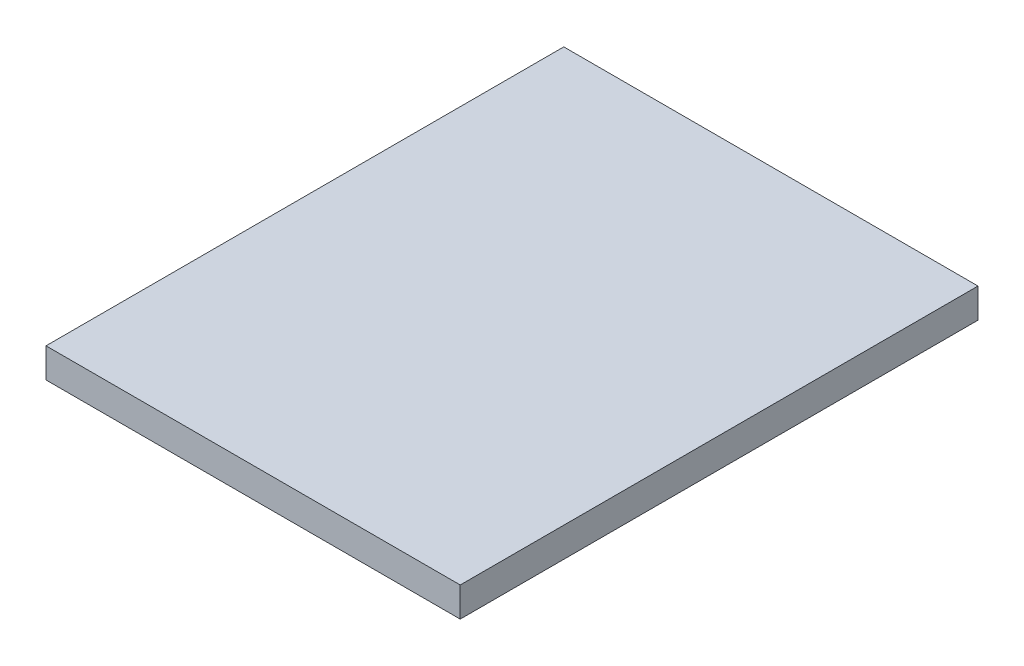
ISO-10303-21;
HEADER;
FILE_DESCRIPTION(('STEP AP214'),'2;1');
FILE_NAME('part.step','',(''),(''),'','','');
FILE_SCHEMA(('AUTOMOTIVE_DESIGN { 1 0 10303 214 1 1 1 1 }'));
ENDSEC;
DATA;
#1=APPLICATION_CONTEXT('core data for automotive mechanical design processes');
#2=APPLICATION_PROTOCOL_DEFINITION('international standard','automotive_design',2000,#1);
#3=PRODUCT_CONTEXT('',#1,'mechanical');
#4=PRODUCT('Part','Part','',(#3));
#5=PRODUCT_RELATED_PRODUCT_CATEGORY('part','',(#4));
#6=PRODUCT_DEFINITION_FORMATION('','',#4);
#7=PRODUCT_DEFINITION_CONTEXT('part definition',#1,'design');
#8=PRODUCT_DEFINITION('design','',#6,#7);
#9=PRODUCT_DEFINITION_SHAPE('','',#8);
#10=(LENGTH_UNIT() NAMED_UNIT(*) SI_UNIT(.MILLI.,.METRE.));
#11=(NAMED_UNIT(*) PLANE_ANGLE_UNIT() SI_UNIT($,.RADIAN.));
#12=(NAMED_UNIT(*) SI_UNIT($,.STERADIAN.) SOLID_ANGLE_UNIT());
#13=UNCERTAINTY_MEASURE_WITH_UNIT(LENGTH_MEASURE(1.E-05),#10,'distance_accuracy_value','');
#14=(GEOMETRIC_REPRESENTATION_CONTEXT(3) GLOBAL_UNCERTAINTY_ASSIGNED_CONTEXT((#13)) GLOBAL_UNIT_ASSIGNED_CONTEXT((#10,
#11,#12)) REPRESENTATION_CONTEXT('',''));
#15=CARTESIAN_POINT('',(0.,0.,0.));
#16=DIRECTION('',(0.,0.,1.));
#17=DIRECTION('',(1.,0.,0.));
#18=AXIS2_PLACEMENT_3D('',#15,#16,#17);
#19=CARTESIAN_POINT('',(-177.8,25.4,-444.5));
#20=DIRECTION('',(1.,0.,0.));
#21=DIRECTION('',(0.,0.,-1.));
#22=AXIS2_PLACEMENT_3D('',#19,#20,#21);
#23=PLANE('',#22);
#24=DIRECTION('',(0.,0.,1.));
#25=VECTOR('',#24,1.);
#26=CARTESIAN_POINT('',(-177.8,0.,-444.5));
#27=LINE('',#26,#25);
#28=CARTESIAN_POINT('',(-177.8,0.,-444.5));
#29=VERTEX_POINT('',#28);
#30=CARTESIAN_POINT('',(-177.8,0.,0.));
#31=VERTEX_POINT('',#30);
#32=EDGE_CURVE('E94',#29,#31,#27,.T.);
#33=ORIENTED_EDGE('',*,*,#32,.T.);
#34=DIRECTION('',(0.,-1.,0.));
#35=VECTOR('',#34,1.);
#36=CARTESIAN_POINT('',(-177.8,25.4,0.));
#37=LINE('',#36,#35);
#38=CARTESIAN_POINT('',(-177.8,25.4,0.));
#39=VERTEX_POINT('',#38);
#40=EDGE_CURVE('E11',#39,#31,#37,.T.);
#41=ORIENTED_EDGE('',*,*,#40,.F.);
#42=DIRECTION('',(0.,0.,1.));
#43=VECTOR('',#42,1.);
#44=CARTESIAN_POINT('',(-177.8,25.4,-444.5));
#45=LINE('',#44,#43);
#46=CARTESIAN_POINT('',(-177.8,25.4,-444.5));
#47=VERTEX_POINT('',#46);
#48=EDGE_CURVE('E82',#47,#39,#45,.T.);
#49=ORIENTED_EDGE('',*,*,#48,.F.);
#50=DIRECTION('',(0.,-1.,0.));
#51=VECTOR('',#50,1.);
#52=CARTESIAN_POINT('',(-177.8,25.4,-444.5));
#53=LINE('',#52,#51);
#54=EDGE_CURVE('E90',#47,#29,#53,.T.);
#55=ORIENTED_EDGE('',*,*,#54,.T.);
#56=EDGE_LOOP('',(#33,#41,#49,#55));
#57=FACE_BOUND('',#56,.T.);
#58=ADVANCED_FACE('F31',(#57),#23,.F.);
#59=CARTESIAN_POINT('',(-177.8,25.4,0.));
#60=DIRECTION('',(0.,0.,-1.));
#61=DIRECTION('',(-1.,0.,0.));
#62=AXIS2_PLACEMENT_3D('',#59,#60,#61);
#63=PLANE('',#62);
#64=DIRECTION('',(1.,0.,0.));
#65=VECTOR('',#64,1.);
#66=CARTESIAN_POINT('',(-177.8,0.,0.));
#67=LINE('',#66,#65);
#68=CARTESIAN_POINT('',(177.8,0.,0.));
#69=VERTEX_POINT('',#68);
#70=EDGE_CURVE('E86',#31,#69,#67,.T.);
#71=ORIENTED_EDGE('',*,*,#70,.T.);
#72=DIRECTION('',(0.,-1.,0.));
#73=VECTOR('',#72,1.);
#74=CARTESIAN_POINT('',(177.8,25.4,0.));
#75=LINE('',#74,#73);
#76=CARTESIAN_POINT('',(177.8,25.4,0.));
#77=VERTEX_POINT('',#76);
#78=EDGE_CURVE('E39',#77,#69,#75,.T.);
#79=ORIENTED_EDGE('',*,*,#78,.F.);
#80=DIRECTION('',(1.,0.,0.));
#81=VECTOR('',#80,1.);
#82=CARTESIAN_POINT('',(-177.8,25.4,0.));
#83=LINE('',#82,#81);
#84=EDGE_CURVE('E77',#39,#77,#83,.T.);
#85=ORIENTED_EDGE('',*,*,#84,.F.);
#86=ORIENTED_EDGE('',*,*,#40,.T.);
#87=EDGE_LOOP('',(#71,#79,#85,#86));
#88=FACE_BOUND('',#87,.T.);
#89=ADVANCED_FACE('F85',(#88),#63,.F.);
#90=CARTESIAN_POINT('',(177.8,25.4,0.));
#91=DIRECTION('',(-1.,0.,0.));
#92=DIRECTION('',(0.,0.,1.));
#93=AXIS2_PLACEMENT_3D('',#90,#91,#92);
#94=PLANE('',#93);
#95=DIRECTION('',(0.,0.,-1.));
#96=VECTOR('',#95,1.);
#97=CARTESIAN_POINT('',(177.8,0.,0.));
#98=LINE('',#97,#96);
#99=CARTESIAN_POINT('',(177.8,0.,-444.5));
#100=VERTEX_POINT('',#99);
#101=EDGE_CURVE('E64',#69,#100,#98,.T.);
#102=ORIENTED_EDGE('',*,*,#101,.T.);
#103=DIRECTION('',(0.,-1.,0.));
#104=VECTOR('',#103,1.);
#105=CARTESIAN_POINT('',(177.8,25.4,-444.5));
#106=LINE('',#105,#104);
#107=CARTESIAN_POINT('',(177.8,25.4,-444.5));
#108=VERTEX_POINT('',#107);
#109=EDGE_CURVE('E87',#108,#100,#106,.T.);
#110=ORIENTED_EDGE('',*,*,#109,.F.);
#111=DIRECTION('',(0.,0.,-1.));
#112=VECTOR('',#111,1.);
#113=CARTESIAN_POINT('',(177.8,25.4,0.));
#114=LINE('',#113,#112);
#115=EDGE_CURVE('E80',#77,#108,#114,.T.);
#116=ORIENTED_EDGE('',*,*,#115,.F.);
#117=ORIENTED_EDGE('',*,*,#78,.T.);
#118=EDGE_LOOP('',(#102,#110,#116,#117));
#119=FACE_BOUND('',#118,.T.);
#120=ADVANCED_FACE('F88',(#119),#94,.F.);
#121=CARTESIAN_POINT('',(177.8,25.4,-444.5));
#122=DIRECTION('',(0.,0.,1.));
#123=DIRECTION('',(1.,0.,0.));
#124=AXIS2_PLACEMENT_3D('',#121,#122,#123);
#125=PLANE('',#124);
#126=DIRECTION('',(-1.,0.,0.));
#127=VECTOR('',#126,1.);
#128=CARTESIAN_POINT('',(177.8,0.,-444.5));
#129=LINE('',#128,#127);
#130=EDGE_CURVE('E70',#100,#29,#129,.T.);
#131=ORIENTED_EDGE('',*,*,#130,.T.);
#132=ORIENTED_EDGE('',*,*,#54,.F.);
#133=DIRECTION('',(-1.,0.,0.));
#134=VECTOR('',#133,1.);
#135=CARTESIAN_POINT('',(177.8,25.4,-444.5));
#136=LINE('',#135,#134);
#137=EDGE_CURVE('E47',#108,#47,#136,.T.);
#138=ORIENTED_EDGE('',*,*,#137,.F.);
#139=ORIENTED_EDGE('',*,*,#109,.T.);
#140=EDGE_LOOP('',(#131,#132,#138,#139));
#141=FACE_BOUND('',#140,.T.);
#142=ADVANCED_FACE('F101',(#141),#125,.F.);
#143=CARTESIAN_POINT('',(-177.8,25.4,0.));
#144=DIRECTION('',(0.,1.,0.));
#145=DIRECTION('',(0.,0.,1.));
#146=AXIS2_PLACEMENT_3D('',#143,#144,#145);
#147=PLANE('',#146);
#148=ORIENTED_EDGE('',*,*,#48,.T.);
#149=ORIENTED_EDGE('',*,*,#84,.T.);
#150=ORIENTED_EDGE('',*,*,#115,.T.);
#151=ORIENTED_EDGE('',*,*,#137,.T.);
#152=EDGE_LOOP('',(#148,#149,#150,#151));
#153=FACE_BOUND('',#152,.T.);
#154=ADVANCED_FACE('F78',(#153),#147,.T.);
#155=CARTESIAN_POINT('',(-177.8,0.,0.));
#156=DIRECTION('',(0.,1.,0.));
#157=DIRECTION('',(0.,0.,1.));
#158=AXIS2_PLACEMENT_3D('',#155,#156,#157);
#159=PLANE('',#158);
#160=ORIENTED_EDGE('',*,*,#32,.F.);
#161=ORIENTED_EDGE('',*,*,#130,.F.);
#162=ORIENTED_EDGE('',*,*,#101,.F.);
#163=ORIENTED_EDGE('',*,*,#70,.F.);
#164=EDGE_LOOP('',(#160,#161,#162,#163));
#165=FACE_BOUND('',#164,.T.);
#166=ADVANCED_FACE('F104',(#165),#159,.F.);
#167=CLOSED_SHELL('',(#58,#89,#120,#142,#154,#166));
#168=MANIFOLD_SOLID_BREP('B2',#167);
#169=ADVANCED_BREP_SHAPE_REPRESENTATION('',(#18,#168),#14);
#170=SHAPE_DEFINITION_REPRESENTATION(#9,#169);
ENDSEC;
END-ISO-10303-21;
